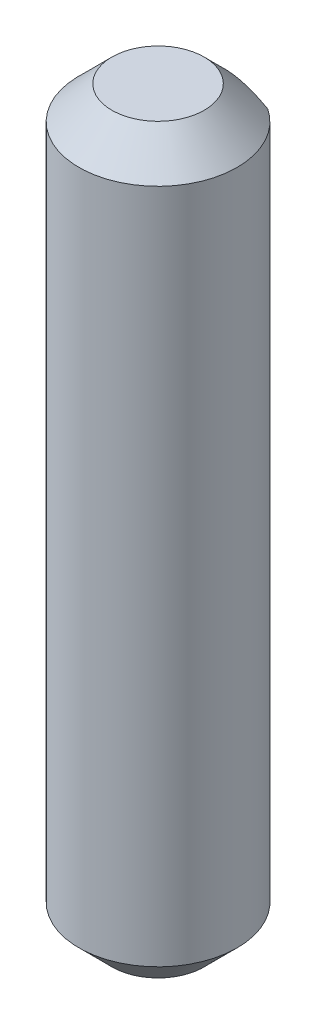
ISO-10303-21;
HEADER;
FILE_DESCRIPTION(('STEP AP214'),'2;1');
FILE_NAME('part.step','',(''),(''),'','','');
FILE_SCHEMA(('AUTOMOTIVE_DESIGN { 1 0 10303 214 1 1 1 1 }'));
ENDSEC;
DATA;
#1=APPLICATION_CONTEXT('core data for automotive mechanical design processes');
#2=APPLICATION_PROTOCOL_DEFINITION('international standard','automotive_design',2000,#1);
#3=PRODUCT_CONTEXT('',#1,'mechanical');
#4=PRODUCT('Part','Part','',(#3));
#5=PRODUCT_RELATED_PRODUCT_CATEGORY('part','',(#4));
#6=PRODUCT_DEFINITION_FORMATION('','',#4);
#7=PRODUCT_DEFINITION_CONTEXT('part definition',#1,'design');
#8=PRODUCT_DEFINITION('design','',#6,#7);
#9=PRODUCT_DEFINITION_SHAPE('','',#8);
#10=(LENGTH_UNIT() NAMED_UNIT(*) SI_UNIT(.MILLI.,.METRE.));
#11=(NAMED_UNIT(*) PLANE_ANGLE_UNIT() SI_UNIT($,.RADIAN.));
#12=(NAMED_UNIT(*) SI_UNIT($,.STERADIAN.) SOLID_ANGLE_UNIT());
#13=UNCERTAINTY_MEASURE_WITH_UNIT(LENGTH_MEASURE(1.E-05),#10,'distance_accuracy_value','');
#14=(GEOMETRIC_REPRESENTATION_CONTEXT(3) GLOBAL_UNCERTAINTY_ASSIGNED_CONTEXT((#13)) GLOBAL_UNIT_ASSIGNED_CONTEXT((#10,
#11,#12)) REPRESENTATION_CONTEXT('',''));
#15=CARTESIAN_POINT('',(0.,0.,0.));
#16=DIRECTION('',(0.,0.,1.));
#17=DIRECTION('',(1.,0.,0.));
#18=AXIS2_PLACEMENT_3D('',#15,#16,#17);
#19=CARTESIAN_POINT('',(0.,45.,0.));
#20=DIRECTION('',(0.,-1.,0.));
#21=DIRECTION('',(0.,0.,-1.));
#22=AXIS2_PLACEMENT_3D('',#19,#20,#21);
#23=CYLINDRICAL_SURFACE('',#22,4.8);
#24=DIRECTION('',(0.,-1.,0.));
#25=VECTOR('',#24,1.);
#26=CARTESIAN_POINT('',(-2.65329983228432,45.,-4.));
#27=LINE('',#26,#25);
#28=CARTESIAN_POINT('',(-2.65329983228432,43.,-4.));
#29=VERTEX_POINT('',#28);
#30=CARTESIAN_POINT('',(-2.65329983228432,2.00000000000002,-4.));
#31=VERTEX_POINT('',#30);
#32=EDGE_CURVE('E79',#29,#31,#27,.T.);
#33=ORIENTED_EDGE('',*,*,#32,.T.);
#34=CARTESIAN_POINT('',(0.,2.00000000000002,0.));
#35=DIRECTION('',(0.,1.,0.));
#36=DIRECTION('',(0.,0.,1.));
#37=AXIS2_PLACEMENT_3D('',#34,#35,#36);
#38=CIRCLE('',#37,4.8);
#39=CARTESIAN_POINT('',(2.65329983228432,2.00000000000003,-4.));
#40=VERTEX_POINT('',#39);
#41=EDGE_CURVE('E85',#31,#40,#38,.T.);
#42=ORIENTED_EDGE('',*,*,#41,.T.);
#43=DIRECTION('',(0.,-1.,0.));
#44=VECTOR('',#43,1.);
#45=CARTESIAN_POINT('',(2.65329983228432,45.,-4.));
#46=LINE('',#45,#44);
#47=CARTESIAN_POINT('',(2.65329983228432,43.,-4.));
#48=VERTEX_POINT('',#47);
#49=EDGE_CURVE('E77',#48,#40,#46,.T.);
#50=ORIENTED_EDGE('',*,*,#49,.F.);
#51=CARTESIAN_POINT('',(0.,43.,0.));
#52=DIRECTION('',(0.,1.,0.));
#53=DIRECTION('',(0.,0.,1.));
#54=AXIS2_PLACEMENT_3D('',#51,#52,#53);
#55=CIRCLE('',#54,4.8);
#56=EDGE_CURVE('E89',#48,#29,#55,.F.);
#57=ORIENTED_EDGE('',*,*,#56,.T.);
#58=EDGE_LOOP('',(#33,#42,#50,#57));
#59=FACE_BOUND('',#58,.T.);
#60=ADVANCED_FACE('F41',(#59),#23,.T.);
#61=CARTESIAN_POINT('',(-2.65329983228432,45.,-4.));
#62=DIRECTION('',(0.,0.,1.));
#63=DIRECTION('',(1.,0.,0.));
#64=AXIS2_PLACEMENT_3D('',#61,#62,#63);
#65=PLANE('',#64);
#66=ORIENTED_EDGE('',*,*,#49,.T.);
#67=CARTESIAN_POINT('',(2.65329983228432,2.00000000000002,-4.));
#68=CARTESIAN_POINT('',(2.58218185660111,1.96069247322189,-4.));
#69=CARTESIAN_POINT('',(2.51060372584772,1.92221902451736,-4.));
#70=CARTESIAN_POINT('',(2.36643331899407,1.84717211529974,-4.));
#71=CARTESIAN_POINT('',(2.29384075699735,1.81059920469938,-4.));
#72=CARTESIAN_POINT('',(2.07390317379759,1.70384112168011,-4.));
#73=CARTESIAN_POINT('',(1.92494109670662,1.63692104858012,-4.));
#74=CARTESIAN_POINT('',(1.62091075844358,1.5136825684453,-4.));
#75=CARTESIAN_POINT('',(1.46579649849391,1.45747623475036,-4.));
#76=CARTESIAN_POINT('',(1.1511739870685,1.3596809018691,-4.));
#77=CARTESIAN_POINT('',(0.991673066283023,1.31806894478017,-4.));
#78=CARTESIAN_POINT('',(0.712493016922424,1.26131886062341,-4.));
#79=CARTESIAN_POINT('',(0.593649434199448,1.24206982728164,-4.));
#80=CARTESIAN_POINT('',(0.354712624189044,1.21394597421555,-4.));
#81=CARTESIAN_POINT('',(0.234619372491707,1.20507135752097,-4.));
#82=CARTESIAN_POINT('',(-0.00482469720817553,1.19822824038024,-4.));
#83=CARTESIAN_POINT('',(-0.124172763353142,1.20016456908684,-4.));
#84=CARTESIAN_POINT('',(-0.362224986303573,1.21460821422653,-4.));
#85=CARTESIAN_POINT('',(-0.480929072383978,1.22711666900104,-4.));
#86=CARTESIAN_POINT('',(-0.745671874287826,1.26632169304545,-4.));
#87=CARTESIAN_POINT('',(-0.891308106716411,1.29573677012066,-4.));
#88=CARTESIAN_POINT('',(-1.17923123335813,1.36786614363017,-4.));
#89=CARTESIAN_POINT('',(-1.32151667715501,1.41058608937313,-4.));
#90=CARTESIAN_POINT('',(-1.60483599130752,1.50783710226057,-4.));
#91=CARTESIAN_POINT('',(-1.74580036493259,1.56256832221233,-4.));
#92=CARTESIAN_POINT('',(-1.95428222673248,1.65143476660606,-4.));
#93=CARTESIAN_POINT('',(-2.02327730513697,1.68218277781564,-4.));
#94=CARTESIAN_POINT('',(-2.16033315334752,1.74569606873221,-4.));
#95=CARTESIAN_POINT('',(-2.22839393658251,1.77846131940753,-4.));
#96=CARTESIAN_POINT('',(-2.4116220623642,1.86967390501289,-4.));
#97=CARTESIAN_POINT('',(-2.5259336543932,1.92984193687543,-4.));
#98=CARTESIAN_POINT('',(-2.75220879461531,2.0544570838638,-4.));
#99=CARTESIAN_POINT('',(-2.86417188430787,2.11890502451522,-4.));
#100=CARTESIAN_POINT('',(-3.19707959724338,2.31756296494112,-4.));
#101=CARTESIAN_POINT('',(-3.4148970937336,2.45701218273492,-4.));
#102=CARTESIAN_POINT('',(-3.84495007556653,2.74601430435361,-4.));
#103=CARTESIAN_POINT('',(-4.05715814936372,2.89560733406434,-4.));
#104=CARTESIAN_POINT('',(-4.47650674497814,3.20154772648993,-4.));
#105=CARTESIAN_POINT('',(-4.68364907963706,3.35789261587847,-4.));
#106=CARTESIAN_POINT('',(-5.07449498543703,3.66039625155307,-4.));
#107=CARTESIAN_POINT('',(-5.25854959163888,3.80610409565816,-4.));
#108=CARTESIAN_POINT('',(-5.62414439078233,4.10067302961277,-4.));
#109=CARTESIAN_POINT('',(-5.80568432127389,4.24953444455188,-4.));
#110=CARTESIAN_POINT('',(-6.16502096415317,4.54830513650457,-4.));
#111=CARTESIAN_POINT('',(-6.34283681807776,4.69819145469864,-4.));
#112=CARTESIAN_POINT('',(-6.69676679283133,4.9998888903141,-4.));
#113=CARTESIAN_POINT('',(-6.87288125358619,5.15169960862875,-4.));
#114=CARTESIAN_POINT('',(-7.04833542684825,5.30426013213815,-4.));
#115=B_SPLINE_CURVE_WITH_KNOTS('',3,(#67,#68,#69,#70,#71,#72,#73,#74,#75,#76,#77,#78,#79,#80,
#81,#82,#83,#84,#85,#86,#87,#88,#89,#90,#91,#92,#93,#94,#95,#96,#97,#98,#99,#100,#101,#102,#103,
#104,#105,#106,#107,#108,#109,#110,#111,#112,#113,#114),.UNSPECIFIED.,.F.,.F.,(4,2,2,2,2,2,2,2,
2,2,2,2,2,2,2,2,2,2,2,2,2,2,2,4),(0.,0.243763047804672,0.487596239126746,0.977127206575072,
1.47152742810195,1.96514640046503,2.32591790821933,2.68669647623756,3.04430407668746,
3.40195018702713,3.84691997345135,4.29207895428107,4.74531123075735,4.97189542681949,
5.19847636269434,5.58589301324871,5.9733846085166,6.74885793041272,7.52760129125023,
8.30606176494154,9.01026739863272,9.71454598288524,10.4122124960369,11.1097366114308),.UNSPECIFIED.);
#116=EDGE_CURVE('E84',#40,#31,#115,.T.);
#117=ORIENTED_EDGE('',*,*,#116,.T.);
#118=ORIENTED_EDGE('',*,*,#32,.F.);
#119=CARTESIAN_POINT('',(-2.65329983228432,43.,-4.));
#120=CARTESIAN_POINT('',(-2.58218185660111,43.0393075267781,-4.));
#121=CARTESIAN_POINT('',(-2.51060372584772,43.0777809754827,-4.));
#122=CARTESIAN_POINT('',(-2.36643331899407,43.1528278847003,-4.));
#123=CARTESIAN_POINT('',(-2.29384075699736,43.1894007953006,-4.));
#124=CARTESIAN_POINT('',(-2.0739031737976,43.2961588783199,-4.));
#125=CARTESIAN_POINT('',(-1.92494109670663,43.3630789514199,-4.));
#126=CARTESIAN_POINT('',(-1.62091075844359,43.4863174315547,-4.));
#127=CARTESIAN_POINT('',(-1.46579649849393,43.5425237652497,-4.));
#128=CARTESIAN_POINT('',(-1.15117398706852,43.6403190981309,-4.));
#129=CARTESIAN_POINT('',(-0.991673066283041,43.6819310552199,-4.));
#130=CARTESIAN_POINT('',(-0.712493016922445,43.7386811393766,-4.));
#131=CARTESIAN_POINT('',(-0.59364943419947,43.7579301727184,-4.));
#132=CARTESIAN_POINT('',(-0.35471262418907,43.7860540257845,-4.));
#133=CARTESIAN_POINT('',(-0.234619372491735,43.7949286424791,-4.));
#134=CARTESIAN_POINT('',(0.00482469720814424,43.8017717596198,-4.));
#135=CARTESIAN_POINT('',(0.124172763353109,43.7998354309132,-4.));
#136=CARTESIAN_POINT('',(0.362224986303536,43.7853917857735,-4.));
#137=CARTESIAN_POINT('',(0.48092907238394,43.772883330999,-4.));
#138=CARTESIAN_POINT('',(0.745671874287782,43.7336783069546,-4.));
#139=CARTESIAN_POINT('',(0.891308106716362,43.7042632298794,-4.));
#140=CARTESIAN_POINT('',(1.17923123335807,43.6321338563699,-4.));
#141=CARTESIAN_POINT('',(1.32151667715495,43.5894139106269,-4.));
#142=CARTESIAN_POINT('',(1.60483599130745,43.4921628977395,-4.));
#143=CARTESIAN_POINT('',(1.74580036493252,43.4374316777877,-4.));
#144=CARTESIAN_POINT('',(1.9542822267324,43.348565233394,-4.));
#145=CARTESIAN_POINT('',(2.02327730513689,43.3178172221844,-4.));
#146=CARTESIAN_POINT('',(2.16033315334744,43.2543039312679,-4.));
#147=CARTESIAN_POINT('',(2.22839393658243,43.2215386805925,-4.));
#148=CARTESIAN_POINT('',(2.41162206236411,43.1303260949872,-4.));
#149=CARTESIAN_POINT('',(2.5259336543931,43.0701580631247,-4.));
#150=CARTESIAN_POINT('',(2.75220879461519,42.9455429161363,-4.));
#151=CARTESIAN_POINT('',(2.86417188430774,42.8810949754849,-4.));
#152=CARTESIAN_POINT('',(3.19707959724323,42.682437035059,-4.));
#153=CARTESIAN_POINT('',(3.41489709373344,42.5429878172652,-4.));
#154=CARTESIAN_POINT('',(3.84495007556634,42.2539856956465,-4.));
#155=CARTESIAN_POINT('',(4.05715814936351,42.1043926659358,-4.));
#156=CARTESIAN_POINT('',(4.47650674497791,41.7984522735103,-4.));
#157=CARTESIAN_POINT('',(4.68364907963681,41.6421073841217,-4.));
#158=CARTESIAN_POINT('',(5.07449498543676,41.3396037484471,-4.));
#159=CARTESIAN_POINT('',(5.2585495916386,41.1938959043421,-4.));
#160=CARTESIAN_POINT('',(5.62414439078202,40.8993269703875,-4.));
#161=CARTESIAN_POINT('',(5.80568432127357,40.7504655554484,-4.));
#162=CARTESIAN_POINT('',(6.16502096415283,40.4516948634957,-4.));
#163=CARTESIAN_POINT('',(6.3428368180774,40.3018085453016,-4.));
#164=CARTESIAN_POINT('',(6.69676679283095,40.0001111096862,-4.));
#165=CARTESIAN_POINT('',(6.87288125358581,39.8483003913716,-4.));
#166=CARTESIAN_POINT('',(7.04833542684785,39.6957398678622,-4.));
#167=B_SPLINE_CURVE_WITH_KNOTS('',3,(#119,#120,#121,#122,#123,#124,#125,#126,#127,#128,#129,
#130,#131,#132,#133,#134,#135,#136,#137,#138,#139,#140,#141,#142,#143,#144,#145,#146,#147,#148,
#149,#150,#151,#152,#153,#154,#155,#156,#157,#158,#159,#160,#161,#162,#163,#164,#165,#166),
.UNSPECIFIED.,.F.,.F.,(4,2,2,2,2,2,2,2,2,2,2,2,2,2,2,2,2,2,2,2,2,2,2,4),(0.,0.24376304780467,
0.487596239126738,0.977127206575059,1.47152742810194,1.96514640046502,2.32591790821931,
2.68669647623753,3.04430407668743,3.4019501870271,3.8469199734513,4.29207895428101,
4.74531123075727,4.97189542681941,5.19847636269424,5.58589301324859,5.97338460851646,
6.74885793041252,7.52760129124997,8.30606176494123,9.01026739863236,9.71454598288484,
10.4122124960365,11.1097366114303),.UNSPECIFIED.);
#168=EDGE_CURVE('E74',#29,#48,#167,.T.);
#169=ORIENTED_EDGE('',*,*,#168,.T.);
#170=EDGE_LOOP('',(#66,#117,#118,#169));
#171=FACE_BOUND('',#170,.T.);
#172=ADVANCED_FACE('F76',(#171),#65,.F.);
#173=CARTESIAN_POINT('',(0.,45.,0.));
#174=DIRECTION('',(0.,1.,0.));
#175=DIRECTION('',(0.,0.,1.));
#176=AXIS2_PLACEMENT_3D('',#173,#174,#175);
#177=PLANE('',#176);
#178=CARTESIAN_POINT('',(0.,45.,0.));
#179=DIRECTION('',(0.,1.,0.));
#180=DIRECTION('',(0.,0.,1.));
#181=AXIS2_PLACEMENT_3D('',#178,#179,#180);
#182=CIRCLE('',#181,2.80000000000002);
#183=CARTESIAN_POINT('',(-1.5477582354992,45.,-2.33333333333335));
#184=VERTEX_POINT('',#183);
#185=EDGE_CURVE('E11',#184,#184,#182,.T.);
#186=ORIENTED_EDGE('',*,*,#185,.T.);
#187=EDGE_LOOP('',(#186));
#188=FACE_BOUND('',#187,.T.);
#189=ADVANCED_FACE('F112',(#188),#177,.T.);
#190=CARTESIAN_POINT('',(0.,0.,0.));
#191=DIRECTION('',(0.,1.,0.));
#192=DIRECTION('',(0.,0.,1.));
#193=AXIS2_PLACEMENT_3D('',#190,#191,#192);
#194=PLANE('',#193);
#195=CARTESIAN_POINT('',(0.,0.,0.));
#196=DIRECTION('',(0.,1.,0.));
#197=DIRECTION('',(0.,0.,1.));
#198=AXIS2_PLACEMENT_3D('',#195,#196,#197);
#199=CIRCLE('',#198,2.79999999999996);
#200=CARTESIAN_POINT('',(-1.54775823549917,0.,-2.3333333333333));
#201=VERTEX_POINT('',#200);
#202=EDGE_CURVE('E52',#201,#201,#199,.F.);
#203=ORIENTED_EDGE('',*,*,#202,.T.);
#204=EDGE_LOOP('',(#203));
#205=FACE_BOUND('',#204,.T.);
#206=ADVANCED_FACE('F113',(#205),#194,.F.);
#207=CARTESIAN_POINT('',(0.,2.00000000000002,0.));
#208=DIRECTION('',(0.,1.,0.));
#209=DIRECTION('',(0.,0.,1.));
#210=AXIS2_PLACEMENT_3D('',#207,#208,#209);
#211=CONICAL_SURFACE('',#210,4.8,0.785398163397453);
#212=ORIENTED_EDGE('',*,*,#202,.F.);
#213=EDGE_LOOP('',(#212));
#214=FACE_BOUND('',#213,.T.);
#215=ORIENTED_EDGE('',*,*,#116,.F.);
#216=ORIENTED_EDGE('',*,*,#41,.F.);
#217=EDGE_LOOP('',(#215,#216));
#218=FACE_BOUND('',#217,.T.);
#219=ADVANCED_FACE('F118',(#214,#218),#211,.T.);
#220=CARTESIAN_POINT('',(0.,45.,0.));
#221=DIRECTION('',(0.,-1.,0.));
#222=DIRECTION('',(0.,0.,-1.));
#223=AXIS2_PLACEMENT_3D('',#220,#221,#222);
#224=CONICAL_SURFACE('',#223,2.80000000000002,0.785398163397445);
#225=ORIENTED_EDGE('',*,*,#168,.F.);
#226=ORIENTED_EDGE('',*,*,#56,.F.);
#227=EDGE_LOOP('',(#225,#226));
#228=FACE_BOUND('',#227,.T.);
#229=ORIENTED_EDGE('',*,*,#185,.F.);
#230=EDGE_LOOP('',(#229));
#231=FACE_BOUND('',#230,.T.);
#232=ADVANCED_FACE('F44',(#228,#231),#224,.T.);
#233=CLOSED_SHELL('',(#60,#172,#189,#206,#219,#232));
#234=MANIFOLD_SOLID_BREP('B2',#233);
#235=ADVANCED_BREP_SHAPE_REPRESENTATION('',(#18,#234),#14);
#236=SHAPE_DEFINITION_REPRESENTATION(#9,#235);
ENDSEC;
END-ISO-10303-21;
